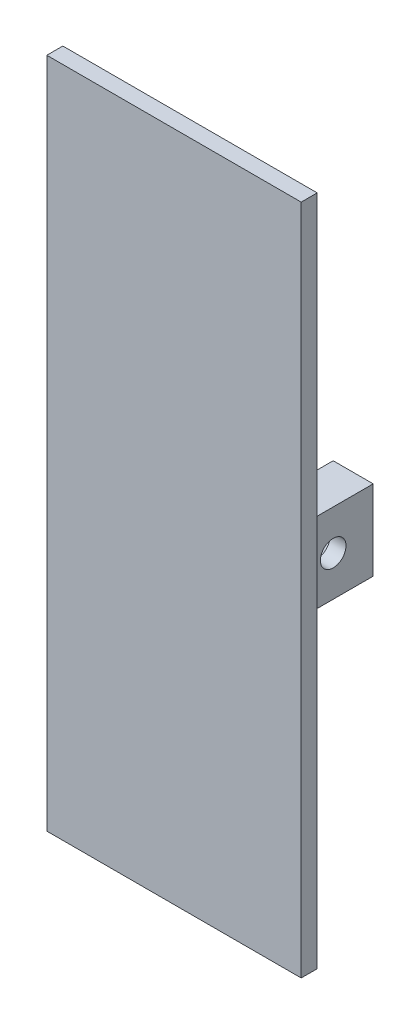
ISO-10303-21;
HEADER;
FILE_DESCRIPTION(('STEP AP214'),'2;1');
FILE_NAME('part.step','',(''),(''),'','','');
FILE_SCHEMA(('AUTOMOTIVE_DESIGN { 1 0 10303 214 1 1 1 1 }'));
ENDSEC;
DATA;
#1=APPLICATION_CONTEXT('core data for automotive mechanical design processes');
#2=APPLICATION_PROTOCOL_DEFINITION('international standard','automotive_design',2000,#1);
#3=PRODUCT_CONTEXT('',#1,'mechanical');
#4=PRODUCT('Part','Part','',(#3));
#5=PRODUCT_RELATED_PRODUCT_CATEGORY('part','',(#4));
#6=PRODUCT_DEFINITION_FORMATION('','',#4);
#7=PRODUCT_DEFINITION_CONTEXT('part definition',#1,'design');
#8=PRODUCT_DEFINITION('design','',#6,#7);
#9=PRODUCT_DEFINITION_SHAPE('','',#8);
#10=(LENGTH_UNIT() NAMED_UNIT(*) SI_UNIT(.MILLI.,.METRE.));
#11=(NAMED_UNIT(*) PLANE_ANGLE_UNIT() SI_UNIT($,.RADIAN.));
#12=(NAMED_UNIT(*) SI_UNIT($,.STERADIAN.) SOLID_ANGLE_UNIT());
#13=UNCERTAINTY_MEASURE_WITH_UNIT(LENGTH_MEASURE(1.E-05),#10,'distance_accuracy_value','');
#14=(GEOMETRIC_REPRESENTATION_CONTEXT(3) GLOBAL_UNCERTAINTY_ASSIGNED_CONTEXT((#13)) GLOBAL_UNIT_ASSIGNED_CONTEXT((#10,
#11,#12)) REPRESENTATION_CONTEXT('',''));
#15=CARTESIAN_POINT('',(0.,0.,0.));
#16=DIRECTION('',(0.,0.,1.));
#17=DIRECTION('',(1.,0.,0.));
#18=AXIS2_PLACEMENT_3D('',#15,#16,#17);
#19=CARTESIAN_POINT('',(0.,0.,-0.001));
#20=DIRECTION('',(0.,0.,-1.));
#21=DIRECTION('',(-1.,0.,0.));
#22=AXIS2_PLACEMENT_3D('',#19,#20,#21);
#23=PLANE('',#22);
#24=DIRECTION('',(0.,-1.,0.));
#25=VECTOR('',#24,1.);
#26=CARTESIAN_POINT('',(8.9,0.,-0.001));
#27=LINE('',#26,#25);
#28=CARTESIAN_POINT('',(8.9,5.,-0.001));
#29=VERTEX_POINT('',#28);
#30=CARTESIAN_POINT('',(8.9,-5.,-0.000999999999999265));
#31=VERTEX_POINT('',#30);
#32=EDGE_CURVE('E58',#29,#31,#27,.T.);
#33=ORIENTED_EDGE('',*,*,#32,.T.);
#34=DIRECTION('',(1.,0.,0.));
#35=VECTOR('',#34,1.);
#36=CARTESIAN_POINT('',(0.,-5.,-0.001));
#37=LINE('',#36,#35);
#38=CARTESIAN_POINT('',(13.9,-5.,-0.000999999999999265));
#39=VERTEX_POINT('',#38);
#40=EDGE_CURVE('E12',#31,#39,#37,.T.);
#41=ORIENTED_EDGE('',*,*,#40,.T.);
#42=DIRECTION('',(0.,1.,0.));
#43=VECTOR('',#42,1.);
#44=CARTESIAN_POINT('',(13.9,0.,-0.001));
#45=LINE('',#44,#43);
#46=CARTESIAN_POINT('',(13.9,-39.95,-0.001));
#47=VERTEX_POINT('',#46);
#48=EDGE_CURVE('E278',#47,#39,#45,.T.);
#49=ORIENTED_EDGE('',*,*,#48,.F.);
#50=DIRECTION('',(1.,0.,0.));
#51=VECTOR('',#50,1.);
#52=CARTESIAN_POINT('',(0.,-39.95,-0.001));
#53=LINE('',#52,#51);
#54=CARTESIAN_POINT('',(-13.9,-39.95,-0.001));
#55=VERTEX_POINT('',#54);
#56=EDGE_CURVE('E282',#55,#47,#53,.T.);
#57=ORIENTED_EDGE('',*,*,#56,.F.);
#58=DIRECTION('',(0.,1.,0.));
#59=VECTOR('',#58,1.);
#60=CARTESIAN_POINT('',(-13.9,0.,-0.001));
#61=LINE('',#60,#59);
#62=CARTESIAN_POINT('',(-13.9,39.95,-0.001));
#63=VERTEX_POINT('',#62);
#64=EDGE_CURVE('E287',#55,#63,#61,.T.);
#65=ORIENTED_EDGE('',*,*,#64,.T.);
#66=DIRECTION('',(1.,0.,0.));
#67=VECTOR('',#66,1.);
#68=CARTESIAN_POINT('',(0.,39.95,-0.001));
#69=LINE('',#68,#67);
#70=CARTESIAN_POINT('',(13.9,39.95,-0.001));
#71=VERTEX_POINT('',#70);
#72=EDGE_CURVE('E290',#63,#71,#69,.T.);
#73=ORIENTED_EDGE('',*,*,#72,.T.);
#74=CARTESIAN_POINT('',(13.9,5.,-0.000999999999999265));
#75=VERTEX_POINT('',#74);
#76=EDGE_CURVE('E283',#75,#71,#45,.T.);
#77=ORIENTED_EDGE('',*,*,#76,.F.);
#78=DIRECTION('',(-1.,0.,0.));
#79=VECTOR('',#78,1.);
#80=CARTESIAN_POINT('',(0.,5.,-0.001));
#81=LINE('',#80,#79);
#82=EDGE_CURVE('E364',#75,#29,#81,.T.);
#83=ORIENTED_EDGE('',*,*,#82,.T.);
#84=EDGE_LOOP('',(#33,#41,#49,#57,#65,#73,#77,#83));
#85=FACE_BOUND('',#84,.T.);
#86=ADVANCED_FACE('F49',(#85),#23,.T.);
#87=CARTESIAN_POINT('',(-15.9,-42.,2.));
#88=DIRECTION('',(1.,0.,0.));
#89=DIRECTION('',(0.,0.,-1.));
#90=AXIS2_PLACEMENT_3D('',#87,#88,#89);
#91=PLANE('',#90);
#92=DIRECTION('',(0.,-1.,0.));
#93=VECTOR('',#92,1.);
#94=CARTESIAN_POINT('',(-15.9,-42.,0.));
#95=LINE('',#94,#93);
#96=CARTESIAN_POINT('',(-15.9,42.,0.));
#97=VERTEX_POINT('',#96);
#98=CARTESIAN_POINT('',(-15.9,-42.,0.));
#99=VERTEX_POINT('',#98);
#100=EDGE_CURVE('E322',#97,#99,#95,.T.);
#101=ORIENTED_EDGE('',*,*,#100,.T.);
#102=DIRECTION('',(0.,0.,-1.));
#103=VECTOR('',#102,1.);
#104=CARTESIAN_POINT('',(-15.9,-42.,2.));
#105=LINE('',#104,#103);
#106=CARTESIAN_POINT('',(-15.9,-42.,2.));
#107=VERTEX_POINT('',#106);
#108=EDGE_CURVE('E360',#107,#99,#105,.T.);
#109=ORIENTED_EDGE('',*,*,#108,.F.);
#110=DIRECTION('',(0.,-1.,0.));
#111=VECTOR('',#110,1.);
#112=CARTESIAN_POINT('',(-15.9,-42.,2.));
#113=LINE('',#112,#111);
#114=CARTESIAN_POINT('',(-15.9,42.,2.));
#115=VERTEX_POINT('',#114);
#116=EDGE_CURVE('E323',#115,#107,#113,.T.);
#117=ORIENTED_EDGE('',*,*,#116,.F.);
#118=DIRECTION('',(0.,0.,-1.));
#119=VECTOR('',#118,1.);
#120=CARTESIAN_POINT('',(-15.9,42.,2.));
#121=LINE('',#120,#119);
#122=EDGE_CURVE('E337',#115,#97,#121,.T.);
#123=ORIENTED_EDGE('',*,*,#122,.T.);
#124=EDGE_LOOP('',(#101,#109,#117,#123));
#125=FACE_BOUND('',#124,.T.);
#126=ADVANCED_FACE('F51',(#125),#91,.F.);
#127=CARTESIAN_POINT('',(15.9,-42.,2.));
#128=DIRECTION('',(0.,1.,0.));
#129=DIRECTION('',(0.,0.,1.));
#130=AXIS2_PLACEMENT_3D('',#127,#128,#129);
#131=PLANE('',#130);
#132=DIRECTION('',(1.,0.,0.));
#133=VECTOR('',#132,1.);
#134=CARTESIAN_POINT('',(15.9,-42.,0.));
#135=LINE('',#134,#133);
#136=CARTESIAN_POINT('',(15.9,-42.,0.));
#137=VERTEX_POINT('',#136);
#138=EDGE_CURVE('E341',#99,#137,#135,.T.);
#139=ORIENTED_EDGE('',*,*,#138,.T.);
#140=DIRECTION('',(0.,0.,-1.));
#141=VECTOR('',#140,1.);
#142=CARTESIAN_POINT('',(15.9,-42.,2.));
#143=LINE('',#142,#141);
#144=CARTESIAN_POINT('',(15.9,-42.,2.));
#145=VERTEX_POINT('',#144);
#146=EDGE_CURVE('E356',#145,#137,#143,.T.);
#147=ORIENTED_EDGE('',*,*,#146,.F.);
#148=DIRECTION('',(1.,0.,0.));
#149=VECTOR('',#148,1.);
#150=CARTESIAN_POINT('',(15.9,-42.,2.));
#151=LINE('',#150,#149);
#152=EDGE_CURVE('E327',#107,#145,#151,.T.);
#153=ORIENTED_EDGE('',*,*,#152,.F.);
#154=ORIENTED_EDGE('',*,*,#108,.T.);
#155=EDGE_LOOP('',(#139,#147,#153,#154));
#156=FACE_BOUND('',#155,.T.);
#157=ADVANCED_FACE('F418',(#156),#131,.F.);
#158=CARTESIAN_POINT('',(15.9,-42.,2.));
#159=DIRECTION('',(-1.,0.,0.));
#160=DIRECTION('',(0.,0.,1.));
#161=AXIS2_PLACEMENT_3D('',#158,#159,#160);
#162=PLANE('',#161);
#163=DIRECTION('',(0.,1.,0.));
#164=VECTOR('',#163,1.);
#165=CARTESIAN_POINT('',(15.9,-42.,0.));
#166=LINE('',#165,#164);
#167=CARTESIAN_POINT('',(15.9,42.,0.));
#168=VERTEX_POINT('',#167);
#169=EDGE_CURVE('E344',#137,#168,#166,.T.);
#170=ORIENTED_EDGE('',*,*,#169,.T.);
#171=DIRECTION('',(0.,0.,-1.));
#172=VECTOR('',#171,1.);
#173=CARTESIAN_POINT('',(15.9,42.,2.));
#174=LINE('',#173,#172);
#175=CARTESIAN_POINT('',(15.9,42.,2.));
#176=VERTEX_POINT('',#175);
#177=EDGE_CURVE('E352',#176,#168,#174,.T.);
#178=ORIENTED_EDGE('',*,*,#177,.F.);
#179=DIRECTION('',(0.,1.,0.));
#180=VECTOR('',#179,1.);
#181=CARTESIAN_POINT('',(15.9,-42.,2.));
#182=LINE('',#181,#180);
#183=EDGE_CURVE('E331',#145,#176,#182,.T.);
#184=ORIENTED_EDGE('',*,*,#183,.F.);
#185=ORIENTED_EDGE('',*,*,#146,.T.);
#186=EDGE_LOOP('',(#170,#178,#184,#185));
#187=FACE_BOUND('',#186,.T.);
#188=ADVANCED_FACE('F441',(#187),#162,.F.);
#189=CARTESIAN_POINT('',(15.9,42.,2.));
#190=DIRECTION('',(0.,-1.,0.));
#191=DIRECTION('',(0.,0.,-1.));
#192=AXIS2_PLACEMENT_3D('',#189,#190,#191);
#193=PLANE('',#192);
#194=DIRECTION('',(-1.,0.,0.));
#195=VECTOR('',#194,1.);
#196=CARTESIAN_POINT('',(15.9,42.,0.));
#197=LINE('',#196,#195);
#198=EDGE_CURVE('E328',#168,#97,#197,.T.);
#199=ORIENTED_EDGE('',*,*,#198,.T.);
#200=ORIENTED_EDGE('',*,*,#122,.F.);
#201=DIRECTION('',(-1.,0.,0.));
#202=VECTOR('',#201,1.);
#203=CARTESIAN_POINT('',(15.9,42.,2.));
#204=LINE('',#203,#202);
#205=EDGE_CURVE('E334',#176,#115,#204,.T.);
#206=ORIENTED_EDGE('',*,*,#205,.F.);
#207=ORIENTED_EDGE('',*,*,#177,.T.);
#208=EDGE_LOOP('',(#199,#200,#206,#207));
#209=FACE_BOUND('',#208,.T.);
#210=ADVANCED_FACE('F435',(#209),#193,.F.);
#211=CARTESIAN_POINT('',(0.,0.,2.));
#212=DIRECTION('',(0.,0.,1.));
#213=DIRECTION('',(1.,0.,0.));
#214=AXIS2_PLACEMENT_3D('',#211,#212,#213);
#215=PLANE('',#214);
#216=ORIENTED_EDGE('',*,*,#116,.T.);
#217=ORIENTED_EDGE('',*,*,#152,.T.);
#218=ORIENTED_EDGE('',*,*,#183,.T.);
#219=ORIENTED_EDGE('',*,*,#205,.T.);
#220=EDGE_LOOP('',(#216,#217,#218,#219));
#221=FACE_BOUND('',#220,.T.);
#222=ADVANCED_FACE('F432',(#221),#215,.T.);
#223=CARTESIAN_POINT('',(0.,0.,0.));
#224=DIRECTION('',(0.,0.,1.));
#225=DIRECTION('',(1.,0.,0.));
#226=AXIS2_PLACEMENT_3D('',#223,#224,#225);
#227=PLANE('',#226);
#228=DIRECTION('',(1.,0.,0.));
#229=VECTOR('',#228,1.);
#230=CARTESIAN_POINT('',(0.,-39.95,0.));
#231=LINE('',#230,#229);
#232=CARTESIAN_POINT('',(-13.9,-39.95,0.));
#233=VERTEX_POINT('',#232);
#234=CARTESIAN_POINT('',(13.9,-39.95,0.));
#235=VERTEX_POINT('',#234);
#236=EDGE_CURVE('E297',#233,#235,#231,.T.);
#237=ORIENTED_EDGE('',*,*,#236,.T.);
#238=DIRECTION('',(0.,1.,0.));
#239=VECTOR('',#238,1.);
#240=CARTESIAN_POINT('',(13.9,0.,0.));
#241=LINE('',#240,#239);
#242=CARTESIAN_POINT('',(13.9,39.95,0.));
#243=VERTEX_POINT('',#242);
#244=EDGE_CURVE('E277',#235,#243,#241,.T.);
#245=ORIENTED_EDGE('',*,*,#244,.T.);
#246=DIRECTION('',(1.,0.,0.));
#247=VECTOR('',#246,1.);
#248=CARTESIAN_POINT('',(0.,39.95,0.));
#249=LINE('',#248,#247);
#250=CARTESIAN_POINT('',(-13.9,39.95,0.));
#251=VERTEX_POINT('',#250);
#252=EDGE_CURVE('E304',#251,#243,#249,.T.);
#253=ORIENTED_EDGE('',*,*,#252,.F.);
#254=DIRECTION('',(0.,1.,0.));
#255=VECTOR('',#254,1.);
#256=CARTESIAN_POINT('',(-13.9,0.,0.));
#257=LINE('',#256,#255);
#258=EDGE_CURVE('E301',#233,#251,#257,.T.);
#259=ORIENTED_EDGE('',*,*,#258,.F.);
#260=EDGE_LOOP('',(#237,#245,#253,#259));
#261=FACE_BOUND('',#260,.T.);
#262=ORIENTED_EDGE('',*,*,#100,.F.);
#263=ORIENTED_EDGE('',*,*,#198,.F.);
#264=ORIENTED_EDGE('',*,*,#169,.F.);
#265=ORIENTED_EDGE('',*,*,#138,.F.);
#266=EDGE_LOOP('',(#262,#263,#264,#265));
#267=FACE_BOUND('',#266,.T.);
#268=ADVANCED_FACE('F430',(#261,#267),#227,.F.);
#269=CARTESIAN_POINT('',(13.9,0.,-0.001));
#270=DIRECTION('',(1.,0.,0.));
#271=DIRECTION('',(0.,0.,-1.));
#272=AXIS2_PLACEMENT_3D('',#269,#270,#271);
#273=PLANE('',#272);
#274=CARTESIAN_POINT('',(13.9,0.,-4.));
#275=DIRECTION('',(1.,0.,0.));
#276=DIRECTION('',(0.,0.,-1.));
#277=AXIS2_PLACEMENT_3D('',#274,#275,#276);
#278=CIRCLE('',#277,1.6);
#279=CARTESIAN_POINT('',(13.9,0.,-5.6));
#280=VERTEX_POINT('',#279);
#281=EDGE_CURVE('E207',#280,#280,#278,.F.);
#282=ORIENTED_EDGE('',*,*,#281,.T.);
#283=EDGE_LOOP('',(#282));
#284=FACE_BOUND('',#283,.T.);
#285=DIRECTION('',(0.,0.,1.));
#286=VECTOR('',#285,1.);
#287=CARTESIAN_POINT('',(13.9,39.95,-0.001));
#288=LINE('',#287,#286);
#289=EDGE_CURVE('E294',#71,#243,#288,.T.);
#290=ORIENTED_EDGE('',*,*,#289,.T.);
#291=ORIENTED_EDGE('',*,*,#244,.F.);
#292=DIRECTION('',(0.,0.,1.));
#293=VECTOR('',#292,1.);
#294=CARTESIAN_POINT('',(13.9,-39.95,-0.001));
#295=LINE('',#294,#293);
#296=EDGE_CURVE('E318',#47,#235,#295,.T.);
#297=ORIENTED_EDGE('',*,*,#296,.F.);
#298=ORIENTED_EDGE('',*,*,#48,.T.);
#299=DIRECTION('',(0.,0.,1.));
#300=VECTOR('',#299,1.);
#301=CARTESIAN_POINT('',(13.9,-5.,-9.));
#302=LINE('',#301,#300);
#303=CARTESIAN_POINT('',(13.9,-5.,-9.));
#304=VERTEX_POINT('',#303);
#305=EDGE_CURVE('E274',#304,#39,#302,.T.);
#306=ORIENTED_EDGE('',*,*,#305,.F.);
#307=DIRECTION('',(0.,-1.,0.));
#308=VECTOR('',#307,1.);
#309=CARTESIAN_POINT('',(13.9,5.,-9.));
#310=LINE('',#309,#308);
#311=CARTESIAN_POINT('',(13.9,5.,-9.));
#312=VERTEX_POINT('',#311);
#313=EDGE_CURVE('E240',#312,#304,#310,.T.);
#314=ORIENTED_EDGE('',*,*,#313,.F.);
#315=DIRECTION('',(0.,0.,1.));
#316=VECTOR('',#315,1.);
#317=CARTESIAN_POINT('',(13.9,5.,-9.));
#318=LINE('',#317,#316);
#319=EDGE_CURVE('E264',#312,#75,#318,.T.);
#320=ORIENTED_EDGE('',*,*,#319,.T.);
#321=ORIENTED_EDGE('',*,*,#76,.T.);
#322=EDGE_LOOP('',(#290,#291,#297,#298,#306,#314,#320,#321));
#323=FACE_BOUND('',#322,.T.);
#324=ADVANCED_FACE('F381',(#284,#323),#273,.T.);
#325=CARTESIAN_POINT('',(0.,-39.95,-0.001));
#326=DIRECTION('',(0.,-1.,0.));
#327=DIRECTION('',(0.,0.,-1.));
#328=AXIS2_PLACEMENT_3D('',#325,#326,#327);
#329=PLANE('',#328);
#330=ORIENTED_EDGE('',*,*,#236,.F.);
#331=DIRECTION('',(0.,0.,1.));
#332=VECTOR('',#331,1.);
#333=CARTESIAN_POINT('',(-13.9,-39.95,-0.001));
#334=LINE('',#333,#332);
#335=EDGE_CURVE('E315',#55,#233,#334,.T.);
#336=ORIENTED_EDGE('',*,*,#335,.F.);
#337=ORIENTED_EDGE('',*,*,#56,.T.);
#338=ORIENTED_EDGE('',*,*,#296,.T.);
#339=EDGE_LOOP('',(#330,#336,#337,#338));
#340=FACE_BOUND('',#339,.T.);
#341=ADVANCED_FACE('F385',(#340),#329,.T.);
#342=CARTESIAN_POINT('',(-13.9,0.,-0.001));
#343=DIRECTION('',(1.,0.,0.));
#344=DIRECTION('',(0.,0.,-1.));
#345=AXIS2_PLACEMENT_3D('',#342,#343,#344);
#346=PLANE('',#345);
#347=ORIENTED_EDGE('',*,*,#258,.T.);
#348=DIRECTION('',(0.,0.,1.));
#349=VECTOR('',#348,1.);
#350=CARTESIAN_POINT('',(-13.9,39.95,-0.001));
#351=LINE('',#350,#349);
#352=EDGE_CURVE('E311',#63,#251,#351,.T.);
#353=ORIENTED_EDGE('',*,*,#352,.F.);
#354=ORIENTED_EDGE('',*,*,#64,.F.);
#355=ORIENTED_EDGE('',*,*,#335,.T.);
#356=EDGE_LOOP('',(#347,#353,#354,#355));
#357=FACE_BOUND('',#356,.T.);
#358=ADVANCED_FACE('F390',(#357),#346,.F.);
#359=CARTESIAN_POINT('',(0.,39.95,-0.001));
#360=DIRECTION('',(0.,-1.,0.));
#361=DIRECTION('',(0.,0.,-1.));
#362=AXIS2_PLACEMENT_3D('',#359,#360,#361);
#363=PLANE('',#362);
#364=ORIENTED_EDGE('',*,*,#252,.T.);
#365=ORIENTED_EDGE('',*,*,#289,.F.);
#366=ORIENTED_EDGE('',*,*,#72,.F.);
#367=ORIENTED_EDGE('',*,*,#352,.T.);
#368=EDGE_LOOP('',(#364,#365,#366,#367));
#369=FACE_BOUND('',#368,.T.);
#370=ADVANCED_FACE('F394',(#369),#363,.F.);
#371=CARTESIAN_POINT('',(13.9,-5.,-9.));
#372=DIRECTION('',(0.,1.,0.));
#373=DIRECTION('',(0.,0.,1.));
#374=AXIS2_PLACEMENT_3D('',#371,#372,#373);
#375=PLANE('',#374);
#376=ORIENTED_EDGE('',*,*,#40,.F.);
#377=DIRECTION('',(0.,0.,1.));
#378=VECTOR('',#377,1.);
#379=CARTESIAN_POINT('',(8.9,-5.,-9.));
#380=LINE('',#379,#378);
#381=CARTESIAN_POINT('',(8.9,-5.,-9.));
#382=VERTEX_POINT('',#381);
#383=EDGE_CURVE('E270',#382,#31,#380,.T.);
#384=ORIENTED_EDGE('',*,*,#383,.F.);
#385=DIRECTION('',(-1.,0.,0.));
#386=VECTOR('',#385,1.);
#387=CARTESIAN_POINT('',(13.9,-5.,-9.));
#388=LINE('',#387,#386);
#389=EDGE_CURVE('E255',#304,#382,#388,.T.);
#390=ORIENTED_EDGE('',*,*,#389,.F.);
#391=ORIENTED_EDGE('',*,*,#305,.T.);
#392=EDGE_LOOP('',(#376,#384,#390,#391));
#393=FACE_BOUND('',#392,.T.);
#394=ADVANCED_FACE('F377',(#393),#375,.F.);
#395=CARTESIAN_POINT('',(8.9,5.,-9.));
#396=DIRECTION('',(1.,0.,0.));
#397=DIRECTION('',(0.,0.,-1.));
#398=AXIS2_PLACEMENT_3D('',#395,#396,#397);
#399=PLANE('',#398);
#400=DIRECTION('',(0.,0.,-1.));
#401=VECTOR('',#400,1.);
#402=CARTESIAN_POINT('',(8.9,2.75,-2.41228675972853));
#403=LINE('',#402,#401);
#404=CARTESIAN_POINT('',(8.9,2.75,-2.41228675972853));
#405=VERTEX_POINT('',#404);
#406=CARTESIAN_POINT('',(8.9,2.75,-5.58771324027147));
#407=VERTEX_POINT('',#406);
#408=EDGE_CURVE('E223',#405,#407,#403,.T.);
#409=ORIENTED_EDGE('',*,*,#408,.F.);
#410=DIRECTION('',(0.,0.866025403784438,-0.5));
#411=VECTOR('',#410,1.);
#412=CARTESIAN_POINT('',(8.9,0.,-0.824573519457057));
#413=LINE('',#412,#411);
#414=CARTESIAN_POINT('',(8.9,0.,-0.824573519457057));
#415=VERTEX_POINT('',#414);
#416=EDGE_CURVE('E65',#415,#405,#413,.T.);
#417=ORIENTED_EDGE('',*,*,#416,.F.);
#418=DIRECTION('',(0.,0.866025403784439,0.5));
#419=VECTOR('',#418,1.);
#420=CARTESIAN_POINT('',(8.9,-2.75,-2.41228675972853));
#421=LINE('',#420,#419);
#422=CARTESIAN_POINT('',(8.9,-2.75,-2.41228675972853));
#423=VERTEX_POINT('',#422);
#424=EDGE_CURVE('E200',#423,#415,#421,.T.);
#425=ORIENTED_EDGE('',*,*,#424,.F.);
#426=DIRECTION('',(0.,0.,1.));
#427=VECTOR('',#426,1.);
#428=CARTESIAN_POINT('',(8.9,-2.75,-5.58771324027147));
#429=LINE('',#428,#427);
#430=CARTESIAN_POINT('',(8.9,-2.75,-5.58771324027147));
#431=VERTEX_POINT('',#430);
#432=EDGE_CURVE('E204',#431,#423,#429,.T.);
#433=ORIENTED_EDGE('',*,*,#432,.F.);
#434=DIRECTION('',(0.,-0.866025403784438,0.5));
#435=VECTOR('',#434,1.);
#436=CARTESIAN_POINT('',(8.9,0.,-7.17542648054294));
#437=LINE('',#436,#435);
#438=CARTESIAN_POINT('',(8.9,0.,-7.17542648054294));
#439=VERTEX_POINT('',#438);
#440=EDGE_CURVE('E230',#439,#431,#437,.T.);
#441=ORIENTED_EDGE('',*,*,#440,.F.);
#442=DIRECTION('',(0.,-0.866025403784439,-0.499999999999999));
#443=VECTOR('',#442,1.);
#444=CARTESIAN_POINT('',(8.9,2.75,-5.58771324027147));
#445=LINE('',#444,#443);
#446=EDGE_CURVE('E226',#407,#439,#445,.T.);
#447=ORIENTED_EDGE('',*,*,#446,.F.);
#448=EDGE_LOOP('',(#409,#417,#425,#433,#441,#447));
#449=FACE_BOUND('',#448,.T.);
#450=ORIENTED_EDGE('',*,*,#32,.F.);
#451=DIRECTION('',(0.,0.,1.));
#452=VECTOR('',#451,1.);
#453=CARTESIAN_POINT('',(8.9,5.,-9.));
#454=LINE('',#453,#452);
#455=CARTESIAN_POINT('',(8.9,5.,-9.));
#456=VERTEX_POINT('',#455);
#457=EDGE_CURVE('E73',#456,#29,#454,.T.);
#458=ORIENTED_EDGE('',*,*,#457,.F.);
#459=DIRECTION('',(0.,1.,0.));
#460=VECTOR('',#459,1.);
#461=CARTESIAN_POINT('',(8.9,5.,-9.));
#462=LINE('',#461,#460);
#463=EDGE_CURVE('E258',#382,#456,#462,.T.);
#464=ORIENTED_EDGE('',*,*,#463,.F.);
#465=ORIENTED_EDGE('',*,*,#383,.T.);
#466=EDGE_LOOP('',(#450,#458,#464,#465));
#467=FACE_BOUND('',#466,.T.);
#468=ADVANCED_FACE('F373',(#449,#467),#399,.F.);
#469=CARTESIAN_POINT('',(13.9,5.,-9.));
#470=DIRECTION('',(0.,-1.,0.));
#471=DIRECTION('',(1.,0.,0.));
#472=AXIS2_PLACEMENT_3D('',#469,#470,#471);
#473=PLANE('',#472);
#474=ORIENTED_EDGE('',*,*,#82,.F.);
#475=ORIENTED_EDGE('',*,*,#319,.F.);
#476=DIRECTION('',(1.,0.,0.));
#477=VECTOR('',#476,1.);
#478=CARTESIAN_POINT('',(13.9,5.,-9.));
#479=LINE('',#478,#477);
#480=EDGE_CURVE('E261',#456,#312,#479,.T.);
#481=ORIENTED_EDGE('',*,*,#480,.F.);
#482=ORIENTED_EDGE('',*,*,#457,.T.);
#483=EDGE_LOOP('',(#474,#475,#481,#482));
#484=FACE_BOUND('',#483,.T.);
#485=ADVANCED_FACE('F398',(#484),#473,.F.);
#486=CARTESIAN_POINT('',(0.,0.,-9.));
#487=DIRECTION('',(0.,0.,-1.));
#488=DIRECTION('',(-1.,0.,0.));
#489=AXIS2_PLACEMENT_3D('',#486,#487,#488);
#490=PLANE('',#489);
#491=ORIENTED_EDGE('',*,*,#313,.T.);
#492=ORIENTED_EDGE('',*,*,#389,.T.);
#493=ORIENTED_EDGE('',*,*,#463,.T.);
#494=ORIENTED_EDGE('',*,*,#480,.T.);
#495=EDGE_LOOP('',(#491,#492,#493,#494));
#496=FACE_BOUND('',#495,.T.);
#497=ADVANCED_FACE('F400',(#496),#490,.T.);
#498=CARTESIAN_POINT('',(11.9,0.,-0.824573519457057));
#499=DIRECTION('',(0.,0.5,0.866025403784438));
#500=DIRECTION('',(0.,-0.866025403784438,0.5));
#501=AXIS2_PLACEMENT_3D('',#498,#499,#500);
#502=PLANE('',#501);
#503=ORIENTED_EDGE('',*,*,#416,.T.);
#504=DIRECTION('',(-1.,0.,0.));
#505=VECTOR('',#504,1.);
#506=CARTESIAN_POINT('',(11.9,2.75,-2.41228675972853));
#507=LINE('',#506,#505);
#508=CARTESIAN_POINT('',(11.9,2.75,-2.41228675972853));
#509=VERTEX_POINT('',#508);
#510=EDGE_CURVE('E174',#509,#405,#507,.T.);
#511=ORIENTED_EDGE('',*,*,#510,.F.);
#512=DIRECTION('',(0.,0.866025403784438,-0.5));
#513=VECTOR('',#512,1.);
#514=CARTESIAN_POINT('',(11.9,0.,-0.824573519457057));
#515=LINE('',#514,#513);
#516=CARTESIAN_POINT('',(11.9,0.,-0.824573519457057));
#517=VERTEX_POINT('',#516);
#518=EDGE_CURVE('E178',#517,#509,#515,.T.);
#519=ORIENTED_EDGE('',*,*,#518,.F.);
#520=DIRECTION('',(-1.,0.,0.));
#521=VECTOR('',#520,1.);
#522=CARTESIAN_POINT('',(11.9,0.,-0.824573519457057));
#523=LINE('',#522,#521);
#524=EDGE_CURVE('E237',#517,#415,#523,.T.);
#525=ORIENTED_EDGE('',*,*,#524,.T.);
#526=EDGE_LOOP('',(#503,#511,#519,#525));
#527=FACE_BOUND('',#526,.T.);
#528=ADVANCED_FACE('F176',(#527),#502,.F.);
#529=CARTESIAN_POINT('',(11.9,-2.75,-2.41228675972853));
#530=DIRECTION('',(0.,-0.5,0.866025403784439));
#531=DIRECTION('',(0.,-0.866025403784439,-0.5));
#532=AXIS2_PLACEMENT_3D('',#529,#530,#531);
#533=PLANE('',#532);
#534=ORIENTED_EDGE('',*,*,#424,.T.);
#535=ORIENTED_EDGE('',*,*,#524,.F.);
#536=DIRECTION('',(0.,0.866025403784439,0.5));
#537=VECTOR('',#536,1.);
#538=CARTESIAN_POINT('',(11.9,-2.75,-2.41228675972853));
#539=LINE('',#538,#537);
#540=CARTESIAN_POINT('',(11.9,-2.75,-2.41228675972853));
#541=VERTEX_POINT('',#540);
#542=EDGE_CURVE('E185',#541,#517,#539,.T.);
#543=ORIENTED_EDGE('',*,*,#542,.F.);
#544=DIRECTION('',(-1.,0.,0.));
#545=VECTOR('',#544,1.);
#546=CARTESIAN_POINT('',(11.9,-2.75,-2.41228675972853));
#547=LINE('',#546,#545);
#548=EDGE_CURVE('E241',#541,#423,#547,.T.);
#549=ORIENTED_EDGE('',*,*,#548,.T.);
#550=EDGE_LOOP('',(#534,#535,#543,#549));
#551=FACE_BOUND('',#550,.T.);
#552=ADVANCED_FACE('F408',(#551),#533,.F.);
#553=CARTESIAN_POINT('',(11.9,-2.75,-5.58771324027147));
#554=DIRECTION('',(0.,-1.,0.));
#555=DIRECTION('',(0.,0.,-1.));
#556=AXIS2_PLACEMENT_3D('',#553,#554,#555);
#557=PLANE('',#556);
#558=ORIENTED_EDGE('',*,*,#432,.T.);
#559=ORIENTED_EDGE('',*,*,#548,.F.);
#560=DIRECTION('',(0.,0.,1.));
#561=VECTOR('',#560,1.);
#562=CARTESIAN_POINT('',(11.9,-2.75,-5.58771324027147));
#563=LINE('',#562,#561);
#564=CARTESIAN_POINT('',(11.9,-2.75,-5.58771324027147));
#565=VERTEX_POINT('',#564);
#566=EDGE_CURVE('E216',#565,#541,#563,.T.);
#567=ORIENTED_EDGE('',*,*,#566,.F.);
#568=DIRECTION('',(-1.,0.,0.));
#569=VECTOR('',#568,1.);
#570=CARTESIAN_POINT('',(11.9,-2.75,-5.58771324027147));
#571=LINE('',#570,#569);
#572=EDGE_CURVE('E244',#565,#431,#571,.T.);
#573=ORIENTED_EDGE('',*,*,#572,.T.);
#574=EDGE_LOOP('',(#558,#559,#567,#573));
#575=FACE_BOUND('',#574,.T.);
#576=ADVANCED_FACE('F556',(#575),#557,.F.);
#577=CARTESIAN_POINT('',(11.9,0.,-7.17542648054294));
#578=DIRECTION('',(0.,-0.5,-0.866025403784439));
#579=DIRECTION('',(0.,0.866025403784439,-0.5));
#580=AXIS2_PLACEMENT_3D('',#577,#578,#579);
#581=PLANE('',#580);
#582=ORIENTED_EDGE('',*,*,#440,.T.);
#583=ORIENTED_EDGE('',*,*,#572,.F.);
#584=DIRECTION('',(0.,-0.866025403784438,0.5));
#585=VECTOR('',#584,1.);
#586=CARTESIAN_POINT('',(11.9,0.,-7.17542648054294));
#587=LINE('',#586,#585);
#588=CARTESIAN_POINT('',(11.9,0.,-7.17542648054294));
#589=VERTEX_POINT('',#588);
#590=EDGE_CURVE('E212',#589,#565,#587,.T.);
#591=ORIENTED_EDGE('',*,*,#590,.F.);
#592=DIRECTION('',(-1.,0.,0.));
#593=VECTOR('',#592,1.);
#594=CARTESIAN_POINT('',(11.9,0.,-7.17542648054294));
#595=LINE('',#594,#593);
#596=EDGE_CURVE('E247',#589,#439,#595,.T.);
#597=ORIENTED_EDGE('',*,*,#596,.T.);
#598=EDGE_LOOP('',(#582,#583,#591,#597));
#599=FACE_BOUND('',#598,.T.);
#600=ADVANCED_FACE('F566',(#599),#581,.F.);
#601=CARTESIAN_POINT('',(11.9,2.75,-5.58771324027147));
#602=DIRECTION('',(0.,0.499999999999999,-0.866025403784439));
#603=DIRECTION('',(0.,0.866025403784439,0.499999999999999));
#604=AXIS2_PLACEMENT_3D('',#601,#602,#603);
#605=PLANE('',#604);
#606=ORIENTED_EDGE('',*,*,#446,.T.);
#607=ORIENTED_EDGE('',*,*,#596,.F.);
#608=DIRECTION('',(0.,-0.866025403784439,-0.499999999999999));
#609=VECTOR('',#608,1.);
#610=CARTESIAN_POINT('',(11.9,2.75,-5.58771324027147));
#611=LINE('',#610,#609);
#612=CARTESIAN_POINT('',(11.9,2.75,-5.58771324027147));
#613=VERTEX_POINT('',#612);
#614=EDGE_CURVE('E194',#613,#589,#611,.T.);
#615=ORIENTED_EDGE('',*,*,#614,.F.);
#616=DIRECTION('',(-1.,0.,0.));
#617=VECTOR('',#616,1.);
#618=CARTESIAN_POINT('',(11.9,2.75,-5.58771324027147));
#619=LINE('',#618,#617);
#620=EDGE_CURVE('E184',#613,#407,#619,.T.);
#621=ORIENTED_EDGE('',*,*,#620,.T.);
#622=EDGE_LOOP('',(#606,#607,#615,#621));
#623=FACE_BOUND('',#622,.T.);
#624=ADVANCED_FACE('F576',(#623),#605,.F.);
#625=CARTESIAN_POINT('',(11.9,2.75,-2.41228675972853));
#626=DIRECTION('',(0.,1.,0.));
#627=DIRECTION('',(-1.,0.,0.));
#628=AXIS2_PLACEMENT_3D('',#625,#626,#627);
#629=PLANE('',#628);
#630=ORIENTED_EDGE('',*,*,#408,.T.);
#631=ORIENTED_EDGE('',*,*,#620,.F.);
#632=DIRECTION('',(0.,0.,-1.));
#633=VECTOR('',#632,1.);
#634=CARTESIAN_POINT('',(11.9,2.75,-2.41228675972853));
#635=LINE('',#634,#633);
#636=EDGE_CURVE('E188',#509,#613,#635,.T.);
#637=ORIENTED_EDGE('',*,*,#636,.F.);
#638=ORIENTED_EDGE('',*,*,#510,.T.);
#639=EDGE_LOOP('',(#630,#631,#637,#638));
#640=FACE_BOUND('',#639,.T.);
#641=ADVANCED_FACE('F189',(#640),#629,.F.);
#642=CARTESIAN_POINT('',(11.9,0.,0.));
#643=DIRECTION('',(-1.,0.,0.));
#644=DIRECTION('',(0.,0.,1.));
#645=AXIS2_PLACEMENT_3D('',#642,#643,#644);
#646=PLANE('',#645);
#647=CARTESIAN_POINT('',(11.9,0.,-4.));
#648=DIRECTION('',(-1.,0.,0.));
#649=DIRECTION('',(0.,0.,1.));
#650=AXIS2_PLACEMENT_3D('',#647,#648,#649);
#651=CIRCLE('',#650,1.6);
#652=CARTESIAN_POINT('',(11.9,0.,-2.4));
#653=VERTEX_POINT('',#652);
#654=EDGE_CURVE('E617',#653,#653,#651,.T.);
#655=ORIENTED_EDGE('',*,*,#654,.F.);
#656=EDGE_LOOP('',(#655));
#657=FACE_BOUND('',#656,.T.);
#658=ORIENTED_EDGE('',*,*,#518,.T.);
#659=ORIENTED_EDGE('',*,*,#636,.T.);
#660=ORIENTED_EDGE('',*,*,#614,.T.);
#661=ORIENTED_EDGE('',*,*,#590,.T.);
#662=ORIENTED_EDGE('',*,*,#566,.T.);
#663=ORIENTED_EDGE('',*,*,#542,.T.);
#664=EDGE_LOOP('',(#658,#659,#660,#661,#662,#663));
#665=FACE_BOUND('',#664,.T.);
#666=ADVANCED_FACE('F196',(#657,#665),#646,.T.);
#667=CARTESIAN_POINT('',(18.4254833995939,0.,-4.));
#668=DIRECTION('',(-1.,0.,0.));
#669=DIRECTION('',(0.,0.,1.));
#670=AXIS2_PLACEMENT_3D('',#667,#668,#669);
#671=CYLINDRICAL_SURFACE('',#670,1.6);
#672=ORIENTED_EDGE('',*,*,#654,.T.);
#673=EDGE_LOOP('',(#672));
#674=FACE_BOUND('',#673,.T.);
#675=ORIENTED_EDGE('',*,*,#281,.F.);
#676=EDGE_LOOP('',(#675));
#677=FACE_BOUND('',#676,.T.);
#678=ADVANCED_FACE('F601',(#674,#677),#671,.F.);
#679=CLOSED_SHELL('',(#86,#126,#157,#188,#210,#222,#268,#324,#341,#358,#370,#394,#468,#485,#497,
#528,#552,#576,#600,#624,#641,#666,#678));
#680=MANIFOLD_SOLID_BREP('B2',#679);
#681=ADVANCED_BREP_SHAPE_REPRESENTATION('',(#18,#680),#14);
#682=SHAPE_DEFINITION_REPRESENTATION(#9,#681);
ENDSEC;
END-ISO-10303-21;
